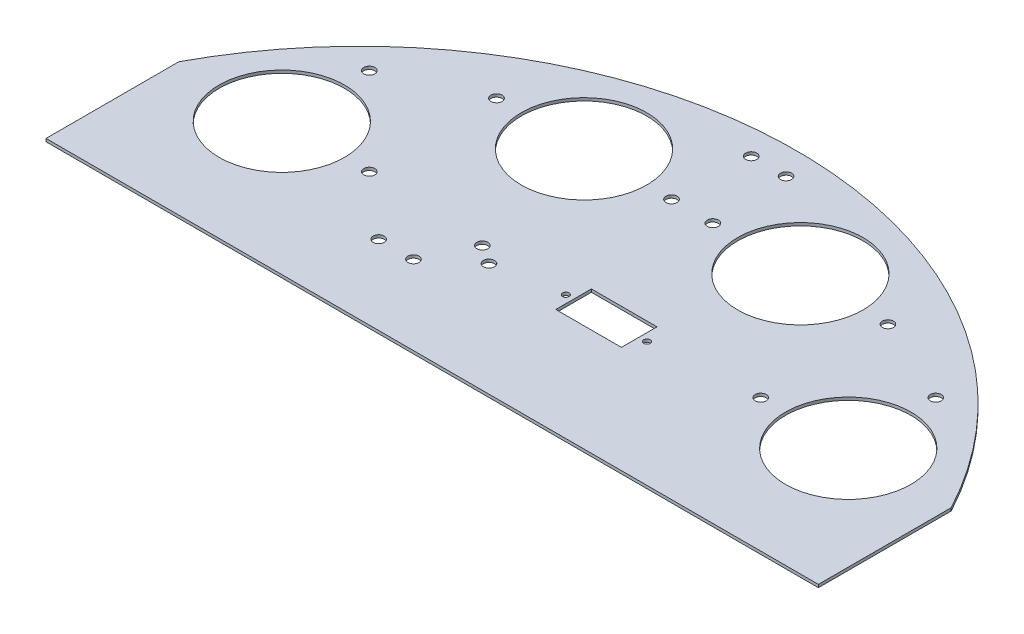
ISO-10303-21;
HEADER;
FILE_DESCRIPTION(('STEP AP214'),'2;1');
FILE_NAME('part.step','',(''),(''),'','','');
FILE_SCHEMA(('AUTOMOTIVE_DESIGN { 1 0 10303 214 1 1 1 1 }'));
ENDSEC;
DATA;
#1=APPLICATION_CONTEXT('core data for automotive mechanical design processes');
#2=APPLICATION_PROTOCOL_DEFINITION('international standard','automotive_design',2000,#1);
#3=PRODUCT_CONTEXT('',#1,'mechanical');
#4=PRODUCT('Part','Part','',(#3));
#5=PRODUCT_RELATED_PRODUCT_CATEGORY('part','',(#4));
#6=PRODUCT_DEFINITION_FORMATION('','',#4);
#7=PRODUCT_DEFINITION_CONTEXT('part definition',#1,'design');
#8=PRODUCT_DEFINITION('design','',#6,#7);
#9=PRODUCT_DEFINITION_SHAPE('','',#8);
#10=(LENGTH_UNIT() NAMED_UNIT(*) SI_UNIT(.MILLI.,.METRE.));
#11=(NAMED_UNIT(*) PLANE_ANGLE_UNIT() SI_UNIT($,.RADIAN.));
#12=(NAMED_UNIT(*) SI_UNIT($,.STERADIAN.) SOLID_ANGLE_UNIT());
#13=UNCERTAINTY_MEASURE_WITH_UNIT(LENGTH_MEASURE(1.E-05),#10,'distance_accuracy_value','');
#14=(GEOMETRIC_REPRESENTATION_CONTEXT(3) GLOBAL_UNCERTAINTY_ASSIGNED_CONTEXT((#13)) GLOBAL_UNIT_ASSIGNED_CONTEXT((#10,
#11,#12)) REPRESENTATION_CONTEXT('',''));
#15=CARTESIAN_POINT('',(0.,0.,0.));
#16=DIRECTION('',(0.,0.,1.));
#17=DIRECTION('',(1.,0.,0.));
#18=AXIS2_PLACEMENT_3D('',#15,#16,#17);
#19=CARTESIAN_POINT('',(0.,0.,0.));
#20=DIRECTION('',(0.,1.,0.));
#21=DIRECTION('',(0.,0.,1.));
#22=AXIS2_PLACEMENT_3D('',#19,#20,#21);
#23=PLANE('',#22);
#24=CARTESIAN_POINT('',(67.237534512333,0.,-26.561617597691));
#25=DIRECTION('',(0.,-1.,0.));
#26=DIRECTION('',(0.,0.,-1.));
#27=AXIS2_PLACEMENT_3D('',#24,#25,#26);
#28=CIRCLE('',#27,1.89865);
#29=CARTESIAN_POINT('',(67.237534512333,0.,-28.460267597691));
#30=VERTEX_POINT('',#29);
#31=EDGE_CURVE('E472',#30,#30,#28,.T.);
#32=ORIENTED_EDGE('',*,*,#31,.F.);
#33=EDGE_LOOP('',(#32));
#34=FACE_BOUND('',#33,.T.);
#35=CARTESIAN_POINT('',(67.2375345123306,0.,-70.1541692780059));
#36=DIRECTION('',(0.,-1.,0.));
#37=DIRECTION('',(0.,0.,-1.));
#38=AXIS2_PLACEMENT_3D('',#35,#36,#37);
#39=CIRCLE('',#38,1.89865);
#40=CARTESIAN_POINT('',(67.2375345123306,0.,-72.0528192780059));
#41=VERTEX_POINT('',#40);
#42=EDGE_CURVE('E480',#41,#41,#39,.T.);
#43=ORIENTED_EDGE('',*,*,#42,.F.);
#44=EDGE_LOOP('',(#43));
#45=FACE_BOUND('',#44,.T.);
#46=CARTESIAN_POINT('',(7.23753451233063,0.,-70.1541692780059));
#47=DIRECTION('',(0.,-1.,0.));
#48=DIRECTION('',(0.,0.,-1.));
#49=AXIS2_PLACEMENT_3D('',#46,#47,#48);
#50=CIRCLE('',#49,1.89865);
#51=CARTESIAN_POINT('',(7.23753451233063,0.,-72.0528192780059));
#52=VERTEX_POINT('',#51);
#53=EDGE_CURVE('E486',#52,#52,#50,.T.);
#54=ORIENTED_EDGE('',*,*,#53,.F.);
#55=EDGE_LOOP('',(#54));
#56=FACE_BOUND('',#55,.T.);
#57=CARTESIAN_POINT('',(-6.92654413765696,0.,-70.1541692780059));
#58=DIRECTION('',(0.,-1.,0.));
#59=DIRECTION('',(0.,0.,-1.));
#60=AXIS2_PLACEMENT_3D('',#57,#58,#59);
#61=CIRCLE('',#60,1.89865);
#62=CARTESIAN_POINT('',(-6.92654413765696,0.,-72.0528192780059));
#63=VERTEX_POINT('',#62);
#64=EDGE_CURVE('E492',#63,#63,#61,.T.);
#65=ORIENTED_EDGE('',*,*,#64,.F.);
#66=EDGE_LOOP('',(#65));
#67=FACE_BOUND('',#66,.T.);
#68=CARTESIAN_POINT('',(-66.926544137657,0.,-70.1541692780059));
#69=DIRECTION('',(0.,-1.,0.));
#70=DIRECTION('',(0.,0.,-1.));
#71=AXIS2_PLACEMENT_3D('',#68,#69,#70);
#72=CIRCLE('',#71,1.89865);
#73=CARTESIAN_POINT('',(-66.926544137657,0.,-72.0528192780059));
#74=VERTEX_POINT('',#73);
#75=EDGE_CURVE('E498',#74,#74,#72,.T.);
#76=ORIENTED_EDGE('',*,*,#75,.F.);
#77=EDGE_LOOP('',(#76));
#78=FACE_BOUND('',#77,.T.);
#79=CARTESIAN_POINT('',(-96.9265441376548,0.,-56.5616175976809));
#80=DIRECTION('',(0.,-1.,0.));
#81=DIRECTION('',(0.,0.,-1.));
#82=AXIS2_PLACEMENT_3D('',#79,#80,#81);
#83=CIRCLE('',#82,1.89865);
#84=CARTESIAN_POINT('',(-96.9265441376548,0.,-58.4602675976809));
#85=VERTEX_POINT('',#84);
#86=EDGE_CURVE('E504',#85,#85,#83,.T.);
#87=ORIENTED_EDGE('',*,*,#86,.F.);
#88=EDGE_LOOP('',(#87));
#89=FACE_BOUND('',#88,.T.);
#90=CARTESIAN_POINT('',(-66.9265441376548,0.,-26.561617597691));
#91=DIRECTION('',(0.,-1.,0.));
#92=DIRECTION('',(0.,0.,-1.));
#93=AXIS2_PLACEMENT_3D('',#90,#91,#92);
#94=CIRCLE('',#93,1.89865);
#95=CARTESIAN_POINT('',(-66.9265441376548,0.,-28.460267597691));
#96=VERTEX_POINT('',#95);
#97=EDGE_CURVE('E510',#96,#96,#94,.T.);
#98=ORIENTED_EDGE('',*,*,#97,.F.);
#99=EDGE_LOOP('',(#98));
#100=FACE_BOUND('',#99,.T.);
#101=CARTESIAN_POINT('',(-19.1543473807719,0.,-19.7948636797243));
#102=DIRECTION('',(0.,-1.,0.));
#103=DIRECTION('',(0.,0.,-1.));
#104=AXIS2_PLACEMENT_3D('',#101,#102,#103);
#105=CIRCLE('',#104,1.89865);
#106=CARTESIAN_POINT('',(-19.1543473807719,0.,-21.6935136797243));
#107=VERTEX_POINT('',#106);
#108=EDGE_CURVE('E516',#107,#107,#105,.T.);
#109=ORIENTED_EDGE('',*,*,#108,.F.);
#110=EDGE_LOOP('',(#109));
#111=FACE_BOUND('',#110,.T.);
#112=CARTESIAN_POINT('',(-45.2913650837094,0.,-8.12316032959307));
#113=DIRECTION('',(0.,-1.,0.));
#114=DIRECTION('',(0.,0.,-1.));
#115=AXIS2_PLACEMENT_3D('',#112,#113,#114);
#116=CIRCLE('',#115,1.89865);
#117=CARTESIAN_POINT('',(-45.2913650837094,0.,-10.0218103295931));
#118=VERTEX_POINT('',#117);
#119=EDGE_CURVE('E522',#118,#118,#116,.T.);
#120=ORIENTED_EDGE('',*,*,#119,.F.);
#121=EDGE_LOOP('',(#120));
#122=FACE_BOUND('',#121,.T.);
#123=CARTESIAN_POINT('',(-33.3613650837094,0.,-8.12316032959307));
#124=DIRECTION('',(0.,-1.,0.));
#125=DIRECTION('',(0.,0.,-1.));
#126=AXIS2_PLACEMENT_3D('',#123,#124,#125);
#127=CIRCLE('',#126,1.89865);
#128=CARTESIAN_POINT('',(-33.3613650837094,0.,-10.0218103295931));
#129=VERTEX_POINT('',#128);
#130=EDGE_CURVE('E528',#129,#129,#127,.T.);
#131=ORIENTED_EDGE('',*,*,#130,.F.);
#132=EDGE_LOOP('',(#131));
#133=FACE_BOUND('',#132,.T.);
#134=CARTESIAN_POINT('',(-6.06113532178358,0.,-96.6113301229937));
#135=DIRECTION('',(0.,-1.,0.));
#136=DIRECTION('',(0.,0.,-1.));
#137=AXIS2_PLACEMENT_3D('',#134,#135,#136);
#138=CIRCLE('',#137,1.89865);
#139=CARTESIAN_POINT('',(-6.06113532178358,0.,-98.5099801229937));
#140=VERTEX_POINT('',#139);
#141=EDGE_CURVE('E534',#140,#140,#138,.T.);
#142=ORIENTED_EDGE('',*,*,#141,.F.);
#143=EDGE_LOOP('',(#142));
#144=FACE_BOUND('',#143,.T.);
#145=CARTESIAN_POINT('',(5.86886720958533,0.,-96.6113301229937));
#146=DIRECTION('',(0.,-1.,0.));
#147=DIRECTION('',(0.,0.,-1.));
#148=AXIS2_PLACEMENT_3D('',#145,#146,#147);
#149=CIRCLE('',#148,1.89865);
#150=CARTESIAN_POINT('',(5.86886720958533,0.,-98.5099801229937));
#151=VERTEX_POINT('',#150);
#152=EDGE_CURVE('E229',#151,#151,#149,.T.);
#153=ORIENTED_EDGE('',*,*,#152,.F.);
#154=EDGE_LOOP('',(#153));
#155=FACE_BOUND('',#154,.T.);
#156=CARTESIAN_POINT('',(3.27642308215973,0.,-23.7231603295504));
#157=DIRECTION('',(0.,-1.,0.));
#158=DIRECTION('',(0.,0.,-1.));
#159=AXIS2_PLACEMENT_3D('',#156,#157,#158);
#160=CIRCLE('',#159,1.10000000000447);
#161=CARTESIAN_POINT('',(3.27642308215973,0.,-24.8231603295549));
#162=VERTEX_POINT('',#161);
#163=EDGE_CURVE('E124',#162,#162,#160,.T.);
#164=ORIENTED_EDGE('',*,*,#163,.F.);
#165=EDGE_LOOP('',(#164));
#166=FACE_BOUND('',#165,.T.);
#167=CARTESIAN_POINT('',(31.0764230821597,0.,-23.7231603295576));
#168=DIRECTION('',(0.,-1.,0.));
#169=DIRECTION('',(0.,0.,-1.));
#170=AXIS2_PLACEMENT_3D('',#167,#168,#169);
#171=CIRCLE('',#170,1.10000000000448);
#172=CARTESIAN_POINT('',(31.0764230821597,0.,-24.823160329562));
#173=VERTEX_POINT('',#172);
#174=EDGE_CURVE('E240',#173,#173,#171,.T.);
#175=ORIENTED_EDGE('',*,*,#174,.F.);
#176=EDGE_LOOP('',(#175));
#177=FACE_BOUND('',#176,.T.);
#178=CARTESIAN_POINT('',(97.237534512333,0.,-26.561617597691));
#179=DIRECTION('',(0.,1.,0.));
#180=DIRECTION('',(0.,0.,1.));
#181=AXIS2_PLACEMENT_3D('',#178,#179,#180);
#182=CIRCLE('',#181,21.5);
#183=CARTESIAN_POINT('',(97.237534512333,0.,-5.06161759769103));
#184=VERTEX_POINT('',#183);
#185=EDGE_CURVE('E144',#184,#184,#182,.T.);
#186=ORIENTED_EDGE('',*,*,#185,.T.);
#187=EDGE_LOOP('',(#186));
#188=FACE_BOUND('',#187,.T.);
#189=CARTESIAN_POINT('',(37.2375345123306,0.,-70.1541692780098));
#190=DIRECTION('',(0.,1.,0.));
#191=DIRECTION('',(0.,0.,1.));
#192=AXIS2_PLACEMENT_3D('',#189,#190,#191);
#193=CIRCLE('',#192,21.5);
#194=CARTESIAN_POINT('',(37.2375345123306,0.,-48.6541692780098));
#195=VERTEX_POINT('',#194);
#196=EDGE_CURVE('E181',#195,#195,#193,.T.);
#197=ORIENTED_EDGE('',*,*,#196,.T.);
#198=EDGE_LOOP('',(#197));
#199=FACE_BOUND('',#198,.T.);
#200=CARTESIAN_POINT('',(-36.926544137657,0.,-70.1541692780059));
#201=DIRECTION('',(0.,1.,0.));
#202=DIRECTION('',(0.,0.,1.));
#203=AXIS2_PLACEMENT_3D('',#200,#201,#202);
#204=CIRCLE('',#203,21.5);
#205=CARTESIAN_POINT('',(-36.926544137657,0.,-48.6541692780059));
#206=VERTEX_POINT('',#205);
#207=EDGE_CURVE('E178',#206,#206,#204,.T.);
#208=ORIENTED_EDGE('',*,*,#207,.T.);
#209=EDGE_LOOP('',(#208));
#210=FACE_BOUND('',#209,.T.);
#211=CARTESIAN_POINT('',(-96.9265441376548,0.,-26.5616175976809));
#212=DIRECTION('',(0.,1.,0.));
#213=DIRECTION('',(0.,0.,1.));
#214=AXIS2_PLACEMENT_3D('',#211,#212,#213);
#215=CIRCLE('',#214,21.5);
#216=CARTESIAN_POINT('',(-96.9265441376548,0.,-5.0616175976809));
#217=VERTEX_POINT('',#216);
#218=EDGE_CURVE('E175',#217,#217,#215,.T.);
#219=ORIENTED_EDGE('',*,*,#218,.T.);
#220=EDGE_LOOP('',(#219));
#221=FACE_BOUND('',#220,.T.);
#222=DIRECTION('',(0.,0.,1.));
#223=VECTOR('',#222,1.);
#224=CARTESIAN_POINT('',(-132.226234516957,0.,0.));
#225=LINE('',#224,#223);
#226=CARTESIAN_POINT('',(-132.226234516957,0.,-26.5616175976809));
#227=VERTEX_POINT('',#226);
#228=CARTESIAN_POINT('',(-132.226234516957,0.,18.9726126774052));
#229=VERTEX_POINT('',#228);
#230=EDGE_CURVE('E137',#227,#229,#225,.T.);
#231=ORIENTED_EDGE('',*,*,#230,.F.);
#232=CARTESIAN_POINT('',(0.155495187338843,0.,43.9726126774052));
#233=DIRECTION('',(0.,1.,0.));
#234=DIRECTION('',(0.,0.,1.));
#235=AXIS2_PLACEMENT_3D('',#232,#233,#234);
#236=CIRCLE('',#235,150.);
#237=CARTESIAN_POINT('',(132.537224891629,0.,-26.561617597691));
#238=VERTEX_POINT('',#237);
#239=EDGE_CURVE('E173',#238,#227,#236,.T.);
#240=ORIENTED_EDGE('',*,*,#239,.F.);
#241=DIRECTION('',(0.,0.,1.));
#242=VECTOR('',#241,1.);
#243=CARTESIAN_POINT('',(132.537224891629,0.,0.));
#244=LINE('',#243,#242);
#245=CARTESIAN_POINT('',(132.537224891629,0.,18.9726126774052));
#246=VERTEX_POINT('',#245);
#247=EDGE_CURVE('E170',#238,#246,#244,.T.);
#248=ORIENTED_EDGE('',*,*,#247,.T.);
#249=DIRECTION('',(-1.,0.,0.));
#250=VECTOR('',#249,1.);
#251=CARTESIAN_POINT('',(0.,0.,18.9726126774052));
#252=LINE('',#251,#250);
#253=EDGE_CURVE('E167',#246,#229,#252,.T.);
#254=ORIENTED_EDGE('',*,*,#253,.T.);
#255=EDGE_LOOP('',(#231,#240,#248,#254));
#256=FACE_BOUND('',#255,.T.);
#257=DIRECTION('',(1.,0.,0.));
#258=VECTOR('',#257,1.);
#259=CARTESIAN_POINT('',(0.,0.,-17.6231603295567));
#260=LINE('',#259,#258);
#261=CARTESIAN_POINT('',(5.92642308216108,0.,-17.6231603295567));
#262=VERTEX_POINT('',#261);
#263=CARTESIAN_POINT('',(28.4264230821584,0.,-17.6231603295567));
#264=VERTEX_POINT('',#263);
#265=EDGE_CURVE('E60',#262,#264,#260,.T.);
#266=ORIENTED_EDGE('',*,*,#265,.T.);
#267=DIRECTION('',(0.,0.,-1.));
#268=VECTOR('',#267,1.);
#269=CARTESIAN_POINT('',(28.4264230821584,0.,0.));
#270=LINE('',#269,#268);
#271=CARTESIAN_POINT('',(28.4264230821584,0.,-29.8231603295513));
#272=VERTEX_POINT('',#271);
#273=EDGE_CURVE('E118',#264,#272,#270,.T.);
#274=ORIENTED_EDGE('',*,*,#273,.T.);
#275=DIRECTION('',(-1.,0.,0.));
#276=VECTOR('',#275,1.);
#277=CARTESIAN_POINT('',(0.,0.,-29.8231603295513));
#278=LINE('',#277,#276);
#279=CARTESIAN_POINT('',(5.92642308216108,0.,-29.8231603295513));
#280=VERTEX_POINT('',#279);
#281=EDGE_CURVE('E121',#272,#280,#278,.T.);
#282=ORIENTED_EDGE('',*,*,#281,.T.);
#283=DIRECTION('',(0.,0.,1.));
#284=VECTOR('',#283,1.);
#285=CARTESIAN_POINT('',(5.92642308216108,0.,0.));
#286=LINE('',#285,#284);
#287=EDGE_CURVE('E130',#280,#262,#286,.T.);
#288=ORIENTED_EDGE('',*,*,#287,.T.);
#289=EDGE_LOOP('',(#266,#274,#282,#288));
#290=FACE_BOUND('',#289,.T.);
#291=CARTESIAN_POINT('',(-25.6482402627617,0.,-24.0247401835058));
#292=DIRECTION('',(0.,-1.,0.));
#293=DIRECTION('',(0.,0.,-1.));
#294=AXIS2_PLACEMENT_3D('',#291,#292,#293);
#295=CIRCLE('',#294,1.89865);
#296=CARTESIAN_POINT('',(-25.6482402627617,0.,-25.9233901835058));
#297=VERTEX_POINT('',#296);
#298=EDGE_CURVE('E228',#297,#297,#295,.T.);
#299=ORIENTED_EDGE('',*,*,#298,.F.);
#300=EDGE_LOOP('',(#299));
#301=FACE_BOUND('',#300,.T.);
#302=CARTESIAN_POINT('',(97.237534512333,0.,-56.561617597691));
#303=DIRECTION('',(0.,-1.,0.));
#304=DIRECTION('',(0.,0.,-1.));
#305=AXIS2_PLACEMENT_3D('',#302,#303,#304);
#306=CIRCLE('',#305,1.89865);
#307=CARTESIAN_POINT('',(97.237534512333,0.,-58.460267597691));
#308=VERTEX_POINT('',#307);
#309=EDGE_CURVE('E469',#308,#308,#306,.T.);
#310=ORIENTED_EDGE('',*,*,#309,.F.);
#311=EDGE_LOOP('',(#310));
#312=FACE_BOUND('',#311,.T.);
#313=ADVANCED_FACE('F37',(#34,#45,#56,#67,#78,#89,#100,#111,#122,#133,#144,#155,#166,#177,#188,
#199,#210,#221,#256,#290,#301,#312),#23,.F.);
#314=CARTESIAN_POINT('',(0.,1.,0.));
#315=DIRECTION('',(0.,1.,0.));
#316=DIRECTION('',(0.,0.,1.));
#317=AXIS2_PLACEMENT_3D('',#314,#315,#316);
#318=PLANE('',#317);
#319=CARTESIAN_POINT('',(97.237534512333,1.,-56.561617597691));
#320=DIRECTION('',(0.,-1.,0.));
#321=DIRECTION('',(0.,0.,-1.));
#322=AXIS2_PLACEMENT_3D('',#319,#320,#321);
#323=CIRCLE('',#322,1.89865);
#324=CARTESIAN_POINT('',(97.237534512333,1.,-58.460267597691));
#325=VERTEX_POINT('',#324);
#326=EDGE_CURVE('E466',#325,#325,#323,.T.);
#327=ORIENTED_EDGE('',*,*,#326,.T.);
#328=EDGE_LOOP('',(#327));
#329=FACE_BOUND('',#328,.T.);
#330=CARTESIAN_POINT('',(67.237534512333,1.,-26.561617597691));
#331=DIRECTION('',(0.,-1.,0.));
#332=DIRECTION('',(0.,0.,-1.));
#333=AXIS2_PLACEMENT_3D('',#330,#331,#332);
#334=CIRCLE('',#333,1.89865);
#335=CARTESIAN_POINT('',(67.237534512333,1.,-28.460267597691));
#336=VERTEX_POINT('',#335);
#337=EDGE_CURVE('E477',#336,#336,#334,.T.);
#338=ORIENTED_EDGE('',*,*,#337,.T.);
#339=EDGE_LOOP('',(#338));
#340=FACE_BOUND('',#339,.T.);
#341=CARTESIAN_POINT('',(67.2375345123306,1.,-70.1541692780059));
#342=DIRECTION('',(0.,-1.,0.));
#343=DIRECTION('',(0.,0.,-1.));
#344=AXIS2_PLACEMENT_3D('',#341,#342,#343);
#345=CIRCLE('',#344,1.89865);
#346=CARTESIAN_POINT('',(67.2375345123306,1.,-72.0528192780059));
#347=VERTEX_POINT('',#346);
#348=EDGE_CURVE('E483',#347,#347,#345,.T.);
#349=ORIENTED_EDGE('',*,*,#348,.T.);
#350=EDGE_LOOP('',(#349));
#351=FACE_BOUND('',#350,.T.);
#352=CARTESIAN_POINT('',(7.23753451233063,1.,-70.1541692780059));
#353=DIRECTION('',(0.,-1.,0.));
#354=DIRECTION('',(0.,0.,-1.));
#355=AXIS2_PLACEMENT_3D('',#352,#353,#354);
#356=CIRCLE('',#355,1.89865);
#357=CARTESIAN_POINT('',(7.23753451233063,1.,-72.0528192780059));
#358=VERTEX_POINT('',#357);
#359=EDGE_CURVE('E489',#358,#358,#356,.T.);
#360=ORIENTED_EDGE('',*,*,#359,.T.);
#361=EDGE_LOOP('',(#360));
#362=FACE_BOUND('',#361,.T.);
#363=CARTESIAN_POINT('',(-6.92654413765696,1.,-70.1541692780059));
#364=DIRECTION('',(0.,-1.,0.));
#365=DIRECTION('',(0.,0.,-1.));
#366=AXIS2_PLACEMENT_3D('',#363,#364,#365);
#367=CIRCLE('',#366,1.89865);
#368=CARTESIAN_POINT('',(-6.92654413765696,1.,-72.0528192780059));
#369=VERTEX_POINT('',#368);
#370=EDGE_CURVE('E495',#369,#369,#367,.T.);
#371=ORIENTED_EDGE('',*,*,#370,.T.);
#372=EDGE_LOOP('',(#371));
#373=FACE_BOUND('',#372,.T.);
#374=CARTESIAN_POINT('',(-66.926544137657,1.,-70.1541692780059));
#375=DIRECTION('',(0.,-1.,0.));
#376=DIRECTION('',(0.,0.,-1.));
#377=AXIS2_PLACEMENT_3D('',#374,#375,#376);
#378=CIRCLE('',#377,1.89865);
#379=CARTESIAN_POINT('',(-66.926544137657,1.,-72.0528192780059));
#380=VERTEX_POINT('',#379);
#381=EDGE_CURVE('E501',#380,#380,#378,.T.);
#382=ORIENTED_EDGE('',*,*,#381,.T.);
#383=EDGE_LOOP('',(#382));
#384=FACE_BOUND('',#383,.T.);
#385=CARTESIAN_POINT('',(-96.9265441376548,1.,-56.5616175976809));
#386=DIRECTION('',(0.,-1.,0.));
#387=DIRECTION('',(0.,0.,-1.));
#388=AXIS2_PLACEMENT_3D('',#385,#386,#387);
#389=CIRCLE('',#388,1.89865);
#390=CARTESIAN_POINT('',(-96.9265441376548,1.,-58.4602675976809));
#391=VERTEX_POINT('',#390);
#392=EDGE_CURVE('E507',#391,#391,#389,.T.);
#393=ORIENTED_EDGE('',*,*,#392,.T.);
#394=EDGE_LOOP('',(#393));
#395=FACE_BOUND('',#394,.T.);
#396=CARTESIAN_POINT('',(-66.9265441376548,1.,-26.561617597691));
#397=DIRECTION('',(0.,-1.,0.));
#398=DIRECTION('',(0.,0.,-1.));
#399=AXIS2_PLACEMENT_3D('',#396,#397,#398);
#400=CIRCLE('',#399,1.89865);
#401=CARTESIAN_POINT('',(-66.9265441376548,1.,-28.460267597691));
#402=VERTEX_POINT('',#401);
#403=EDGE_CURVE('E513',#402,#402,#400,.T.);
#404=ORIENTED_EDGE('',*,*,#403,.T.);
#405=EDGE_LOOP('',(#404));
#406=FACE_BOUND('',#405,.T.);
#407=CARTESIAN_POINT('',(-19.1543473807719,1.,-19.7948636797243));
#408=DIRECTION('',(0.,-1.,0.));
#409=DIRECTION('',(0.,0.,-1.));
#410=AXIS2_PLACEMENT_3D('',#407,#408,#409);
#411=CIRCLE('',#410,1.89865);
#412=CARTESIAN_POINT('',(-19.1543473807719,1.,-21.6935136797243));
#413=VERTEX_POINT('',#412);
#414=EDGE_CURVE('E519',#413,#413,#411,.T.);
#415=ORIENTED_EDGE('',*,*,#414,.T.);
#416=EDGE_LOOP('',(#415));
#417=FACE_BOUND('',#416,.T.);
#418=CARTESIAN_POINT('',(-45.2913650837094,1.,-8.12316032959307));
#419=DIRECTION('',(0.,-1.,0.));
#420=DIRECTION('',(0.,0.,-1.));
#421=AXIS2_PLACEMENT_3D('',#418,#419,#420);
#422=CIRCLE('',#421,1.89865);
#423=CARTESIAN_POINT('',(-45.2913650837094,1.,-10.0218103295931));
#424=VERTEX_POINT('',#423);
#425=EDGE_CURVE('E525',#424,#424,#422,.T.);
#426=ORIENTED_EDGE('',*,*,#425,.T.);
#427=EDGE_LOOP('',(#426));
#428=FACE_BOUND('',#427,.T.);
#429=CARTESIAN_POINT('',(-33.3613650837094,1.,-8.12316032959307));
#430=DIRECTION('',(0.,-1.,0.));
#431=DIRECTION('',(0.,0.,-1.));
#432=AXIS2_PLACEMENT_3D('',#429,#430,#431);
#433=CIRCLE('',#432,1.89865);
#434=CARTESIAN_POINT('',(-33.3613650837094,1.,-10.0218103295931));
#435=VERTEX_POINT('',#434);
#436=EDGE_CURVE('E531',#435,#435,#433,.T.);
#437=ORIENTED_EDGE('',*,*,#436,.T.);
#438=EDGE_LOOP('',(#437));
#439=FACE_BOUND('',#438,.T.);
#440=CARTESIAN_POINT('',(-6.06113532178358,1.,-96.6113301229937));
#441=DIRECTION('',(0.,-1.,0.));
#442=DIRECTION('',(0.,0.,-1.));
#443=AXIS2_PLACEMENT_3D('',#440,#441,#442);
#444=CIRCLE('',#443,1.89865);
#445=CARTESIAN_POINT('',(-6.06113532178358,1.,-98.5099801229937));
#446=VERTEX_POINT('',#445);
#447=EDGE_CURVE('E234',#446,#446,#444,.T.);
#448=ORIENTED_EDGE('',*,*,#447,.T.);
#449=EDGE_LOOP('',(#448));
#450=FACE_BOUND('',#449,.T.);
#451=DIRECTION('',(0.,0.,-1.));
#452=VECTOR('',#451,1.);
#453=CARTESIAN_POINT('',(28.4264230821584,1.,0.));
#454=LINE('',#453,#452);
#455=CARTESIAN_POINT('',(28.4264230821584,1.,-17.6231603295567));
#456=VERTEX_POINT('',#455);
#457=CARTESIAN_POINT('',(28.4264230821584,1.,-29.8231603295513));
#458=VERTEX_POINT('',#457);
#459=EDGE_CURVE('E113',#456,#458,#454,.T.);
#460=ORIENTED_EDGE('',*,*,#459,.F.);
#461=DIRECTION('',(1.,0.,0.));
#462=VECTOR('',#461,1.);
#463=CARTESIAN_POINT('',(0.,1.,-17.6231603295567));
#464=LINE('',#463,#462);
#465=CARTESIAN_POINT('',(5.92642308216108,1.,-17.6231603295567));
#466=VERTEX_POINT('',#465);
#467=EDGE_CURVE('E109',#466,#456,#464,.T.);
#468=ORIENTED_EDGE('',*,*,#467,.F.);
#469=DIRECTION('',(0.,0.,1.));
#470=VECTOR('',#469,1.);
#471=CARTESIAN_POINT('',(5.92642308216108,1.,0.));
#472=LINE('',#471,#470);
#473=CARTESIAN_POINT('',(5.92642308216108,1.,-29.8231603295513));
#474=VERTEX_POINT('',#473);
#475=EDGE_CURVE('E101',#474,#466,#472,.T.);
#476=ORIENTED_EDGE('',*,*,#475,.F.);
#477=DIRECTION('',(-1.,0.,0.));
#478=VECTOR('',#477,1.);
#479=CARTESIAN_POINT('',(0.,1.,-29.8231603295513));
#480=LINE('',#479,#478);
#481=EDGE_CURVE('E108',#458,#474,#480,.T.);
#482=ORIENTED_EDGE('',*,*,#481,.F.);
#483=EDGE_LOOP('',(#460,#468,#476,#482));
#484=FACE_BOUND('',#483,.T.);
#485=CARTESIAN_POINT('',(97.237534512333,1.,-26.561617597691));
#486=DIRECTION('',(0.,1.,0.));
#487=DIRECTION('',(0.,0.,1.));
#488=AXIS2_PLACEMENT_3D('',#485,#486,#487);
#489=CIRCLE('',#488,21.5);
#490=CARTESIAN_POINT('',(97.237534512333,1.,-5.06161759769103));
#491=VERTEX_POINT('',#490);
#492=EDGE_CURVE('E161',#491,#491,#489,.T.);
#493=ORIENTED_EDGE('',*,*,#492,.F.);
#494=EDGE_LOOP('',(#493));
#495=FACE_BOUND('',#494,.T.);
#496=CARTESIAN_POINT('',(37.2375345123306,1.,-70.1541692780098));
#497=DIRECTION('',(0.,1.,0.));
#498=DIRECTION('',(0.,0.,1.));
#499=AXIS2_PLACEMENT_3D('',#496,#497,#498);
#500=CIRCLE('',#499,21.5);
#501=CARTESIAN_POINT('',(37.2375345123306,1.,-48.6541692780098));
#502=VERTEX_POINT('',#501);
#503=EDGE_CURVE('E158',#502,#502,#500,.T.);
#504=ORIENTED_EDGE('',*,*,#503,.F.);
#505=EDGE_LOOP('',(#504));
#506=FACE_BOUND('',#505,.T.);
#507=CARTESIAN_POINT('',(-36.926544137657,1.,-70.1541692780059));
#508=DIRECTION('',(0.,1.,0.));
#509=DIRECTION('',(0.,0.,1.));
#510=AXIS2_PLACEMENT_3D('',#507,#508,#509);
#511=CIRCLE('',#510,21.5);
#512=CARTESIAN_POINT('',(-36.926544137657,1.,-48.6541692780059));
#513=VERTEX_POINT('',#512);
#514=EDGE_CURVE('E155',#513,#513,#511,.T.);
#515=ORIENTED_EDGE('',*,*,#514,.F.);
#516=EDGE_LOOP('',(#515));
#517=FACE_BOUND('',#516,.T.);
#518=CARTESIAN_POINT('',(-96.9265441376548,1.,-26.5616175976809));
#519=DIRECTION('',(0.,1.,0.));
#520=DIRECTION('',(0.,0.,1.));
#521=AXIS2_PLACEMENT_3D('',#518,#519,#520);
#522=CIRCLE('',#521,21.5);
#523=CARTESIAN_POINT('',(-96.9265441376548,1.,-5.0616175976809));
#524=VERTEX_POINT('',#523);
#525=EDGE_CURVE('E152',#524,#524,#522,.T.);
#526=ORIENTED_EDGE('',*,*,#525,.F.);
#527=EDGE_LOOP('',(#526));
#528=FACE_BOUND('',#527,.T.);
#529=DIRECTION('',(0.,0.,1.));
#530=VECTOR('',#529,1.);
#531=CARTESIAN_POINT('',(-132.226234516957,1.,0.));
#532=LINE('',#531,#530);
#533=CARTESIAN_POINT('',(-132.226234516957,1.,-26.5616175976809));
#534=VERTEX_POINT('',#533);
#535=CARTESIAN_POINT('',(-132.226234516957,1.,18.9726126774052));
#536=VERTEX_POINT('',#535);
#537=EDGE_CURVE('E141',#534,#536,#532,.T.);
#538=ORIENTED_EDGE('',*,*,#537,.T.);
#539=DIRECTION('',(-1.,0.,0.));
#540=VECTOR('',#539,1.);
#541=CARTESIAN_POINT('',(0.,1.,18.9726126774052));
#542=LINE('',#541,#540);
#543=CARTESIAN_POINT('',(132.537224891629,1.,18.9726126774052));
#544=VERTEX_POINT('',#543);
#545=EDGE_CURVE('E143',#544,#536,#542,.T.);
#546=ORIENTED_EDGE('',*,*,#545,.F.);
#547=DIRECTION('',(0.,0.,1.));
#548=VECTOR('',#547,1.);
#549=CARTESIAN_POINT('',(132.537224891629,1.,0.));
#550=LINE('',#549,#548);
#551=CARTESIAN_POINT('',(132.537224891629,1.,-26.561617597691));
#552=VERTEX_POINT('',#551);
#553=EDGE_CURVE('E147',#552,#544,#550,.T.);
#554=ORIENTED_EDGE('',*,*,#553,.F.);
#555=CARTESIAN_POINT('',(0.155495187338843,1.,43.9726126774052));
#556=DIRECTION('',(0.,1.,0.));
#557=DIRECTION('',(0.,0.,1.));
#558=AXIS2_PLACEMENT_3D('',#555,#556,#557);
#559=CIRCLE('',#558,150.);
#560=EDGE_CURVE('E150',#552,#534,#559,.T.);
#561=ORIENTED_EDGE('',*,*,#560,.T.);
#562=EDGE_LOOP('',(#538,#546,#554,#561));
#563=FACE_BOUND('',#562,.T.);
#564=CARTESIAN_POINT('',(31.0764230821597,1.,-23.7231603295576));
#565=DIRECTION('',(0.,-1.,0.));
#566=DIRECTION('',(0.,0.,-1.));
#567=AXIS2_PLACEMENT_3D('',#564,#565,#566);
#568=CIRCLE('',#567,1.10000000000448);
#569=CARTESIAN_POINT('',(31.0764230821597,1.,-24.823160329562));
#570=VERTEX_POINT('',#569);
#571=EDGE_CURVE('E131',#570,#570,#568,.T.);
#572=ORIENTED_EDGE('',*,*,#571,.T.);
#573=EDGE_LOOP('',(#572));
#574=FACE_BOUND('',#573,.T.);
#575=CARTESIAN_POINT('',(3.27642308215973,1.,-23.7231603295504));
#576=DIRECTION('',(0.,-1.,0.));
#577=DIRECTION('',(0.,0.,-1.));
#578=AXIS2_PLACEMENT_3D('',#575,#576,#577);
#579=CIRCLE('',#578,1.10000000000447);
#580=CARTESIAN_POINT('',(3.27642308215973,1.,-24.8231603295549));
#581=VERTEX_POINT('',#580);
#582=EDGE_CURVE('E219',#581,#581,#579,.T.);
#583=ORIENTED_EDGE('',*,*,#582,.T.);
#584=EDGE_LOOP('',(#583));
#585=FACE_BOUND('',#584,.T.);
#586=CARTESIAN_POINT('',(-25.6482402627617,1.,-24.0247401835058));
#587=DIRECTION('',(0.,-1.,0.));
#588=DIRECTION('',(0.,0.,-1.));
#589=AXIS2_PLACEMENT_3D('',#586,#587,#588);
#590=CIRCLE('',#589,1.89865);
#591=CARTESIAN_POINT('',(-25.6482402627617,1.,-25.9233901835058));
#592=VERTEX_POINT('',#591);
#593=EDGE_CURVE('E223',#592,#592,#590,.T.);
#594=ORIENTED_EDGE('',*,*,#593,.T.);
#595=EDGE_LOOP('',(#594));
#596=FACE_BOUND('',#595,.T.);
#597=CARTESIAN_POINT('',(5.86886720958533,1.,-96.6113301229937));
#598=DIRECTION('',(0.,-1.,0.));
#599=DIRECTION('',(0.,0.,-1.));
#600=AXIS2_PLACEMENT_3D('',#597,#598,#599);
#601=CIRCLE('',#600,1.89865);
#602=CARTESIAN_POINT('',(5.86886720958533,1.,-98.5099801229937));
#603=VERTEX_POINT('',#602);
#604=EDGE_CURVE('E226',#603,#603,#601,.T.);
#605=ORIENTED_EDGE('',*,*,#604,.T.);
#606=EDGE_LOOP('',(#605));
#607=FACE_BOUND('',#606,.T.);
#608=ADVANCED_FACE('F116',(#329,#340,#351,#362,#373,#384,#395,#406,#417,#428,#439,#450,#484,
#495,#506,#517,#528,#563,#574,#585,#596,#607),#318,.T.);
#609=CARTESIAN_POINT('',(-132.226234516957,1.,0.));
#610=DIRECTION('',(1.,0.,0.));
#611=DIRECTION('',(0.,0.,-1.));
#612=AXIS2_PLACEMENT_3D('',#609,#610,#611);
#613=PLANE('',#612);
#614=ORIENTED_EDGE('',*,*,#230,.T.);
#615=DIRECTION('',(0.,-1.,0.));
#616=VECTOR('',#615,1.);
#617=CARTESIAN_POINT('',(-132.226234516957,1.,18.9726126774052));
#618=LINE('',#617,#616);
#619=EDGE_CURVE('E11',#536,#229,#618,.T.);
#620=ORIENTED_EDGE('',*,*,#619,.F.);
#621=ORIENTED_EDGE('',*,*,#537,.F.);
#622=DIRECTION('',(0.,-1.,0.));
#623=VECTOR('',#622,1.);
#624=CARTESIAN_POINT('',(-132.226234516957,1.,-26.5616175976809));
#625=LINE('',#624,#623);
#626=EDGE_CURVE('E164',#534,#227,#625,.T.);
#627=ORIENTED_EDGE('',*,*,#626,.T.);
#628=EDGE_LOOP('',(#614,#620,#621,#627));
#629=FACE_BOUND('',#628,.T.);
#630=ADVANCED_FACE('F39',(#629),#613,.F.);
#631=CARTESIAN_POINT('',(0.,1.,18.9726126774052));
#632=DIRECTION('',(0.,0.,1.));
#633=DIRECTION('',(1.,0.,0.));
#634=AXIS2_PLACEMENT_3D('',#631,#632,#633);
#635=PLANE('',#634);
#636=ORIENTED_EDGE('',*,*,#253,.F.);
#637=DIRECTION('',(0.,-1.,0.));
#638=VECTOR('',#637,1.);
#639=CARTESIAN_POINT('',(132.537224891629,1.,18.9726126774052));
#640=LINE('',#639,#638);
#641=EDGE_CURVE('E45',#544,#246,#640,.T.);
#642=ORIENTED_EDGE('',*,*,#641,.F.);
#643=ORIENTED_EDGE('',*,*,#545,.T.);
#644=ORIENTED_EDGE('',*,*,#619,.T.);
#645=EDGE_LOOP('',(#636,#642,#643,#644));
#646=FACE_BOUND('',#645,.T.);
#647=ADVANCED_FACE('F196',(#646),#635,.T.);
#648=CARTESIAN_POINT('',(132.537224891629,1.,0.));
#649=DIRECTION('',(1.,0.,0.));
#650=DIRECTION('',(0.,0.,-1.));
#651=AXIS2_PLACEMENT_3D('',#648,#649,#650);
#652=PLANE('',#651);
#653=ORIENTED_EDGE('',*,*,#247,.F.);
#654=DIRECTION('',(0.,-1.,0.));
#655=VECTOR('',#654,1.);
#656=CARTESIAN_POINT('',(132.537224891629,1.,-26.561617597691));
#657=LINE('',#656,#655);
#658=EDGE_CURVE('E188',#552,#238,#657,.T.);
#659=ORIENTED_EDGE('',*,*,#658,.F.);
#660=ORIENTED_EDGE('',*,*,#553,.T.);
#661=ORIENTED_EDGE('',*,*,#641,.T.);
#662=EDGE_LOOP('',(#653,#659,#660,#661));
#663=FACE_BOUND('',#662,.T.);
#664=ADVANCED_FACE('F192',(#663),#652,.T.);
#665=CARTESIAN_POINT('',(37.2375345123306,1.,-70.1541692780098));
#666=DIRECTION('',(0.,-1.,0.));
#667=DIRECTION('',(0.,0.,-1.));
#668=AXIS2_PLACEMENT_3D('',#665,#666,#667);
#669=CYLINDRICAL_SURFACE('',#668,21.5);
#670=ORIENTED_EDGE('',*,*,#503,.T.);
#671=EDGE_LOOP('',(#670));
#672=FACE_BOUND('',#671,.T.);
#673=ORIENTED_EDGE('',*,*,#196,.F.);
#674=EDGE_LOOP('',(#673));
#675=FACE_BOUND('',#674,.T.);
#676=ADVANCED_FACE('F272',(#672,#675),#669,.F.);
#677=CARTESIAN_POINT('',(-36.926544137657,1.,-70.1541692780059));
#678=DIRECTION('',(0.,-1.,0.));
#679=DIRECTION('',(0.,0.,-1.));
#680=AXIS2_PLACEMENT_3D('',#677,#678,#679);
#681=CYLINDRICAL_SURFACE('',#680,21.5);
#682=ORIENTED_EDGE('',*,*,#514,.T.);
#683=EDGE_LOOP('',(#682));
#684=FACE_BOUND('',#683,.T.);
#685=ORIENTED_EDGE('',*,*,#207,.F.);
#686=EDGE_LOOP('',(#685));
#687=FACE_BOUND('',#686,.T.);
#688=ADVANCED_FACE('F263',(#684,#687),#681,.F.);
#689=CARTESIAN_POINT('',(-96.9265441376548,1.,-26.5616175976809));
#690=DIRECTION('',(0.,-1.,0.));
#691=DIRECTION('',(0.,0.,-1.));
#692=AXIS2_PLACEMENT_3D('',#689,#690,#691);
#693=CYLINDRICAL_SURFACE('',#692,21.5);
#694=ORIENTED_EDGE('',*,*,#525,.T.);
#695=EDGE_LOOP('',(#694));
#696=FACE_BOUND('',#695,.T.);
#697=ORIENTED_EDGE('',*,*,#218,.F.);
#698=EDGE_LOOP('',(#697));
#699=FACE_BOUND('',#698,.T.);
#700=ADVANCED_FACE('F261',(#696,#699),#693,.F.);
#701=CARTESIAN_POINT('',(0.155495187338843,1.,43.9726126774052));
#702=DIRECTION('',(0.,-1.,0.));
#703=DIRECTION('',(0.,0.,-1.));
#704=AXIS2_PLACEMENT_3D('',#701,#702,#703);
#705=CYLINDRICAL_SURFACE('',#704,150.);
#706=ORIENTED_EDGE('',*,*,#239,.T.);
#707=ORIENTED_EDGE('',*,*,#626,.F.);
#708=ORIENTED_EDGE('',*,*,#560,.F.);
#709=ORIENTED_EDGE('',*,*,#658,.T.);
#710=EDGE_LOOP('',(#706,#707,#708,#709));
#711=FACE_BOUND('',#710,.T.);
#712=ADVANCED_FACE('F204',(#711),#705,.T.);
#713=CARTESIAN_POINT('',(97.237534512333,1.,-26.561617597691));
#714=DIRECTION('',(0.,-1.,0.));
#715=DIRECTION('',(0.,0.,-1.));
#716=AXIS2_PLACEMENT_3D('',#713,#714,#715);
#717=CYLINDRICAL_SURFACE('',#716,21.5);
#718=ORIENTED_EDGE('',*,*,#492,.T.);
#719=EDGE_LOOP('',(#718));
#720=FACE_BOUND('',#719,.T.);
#721=ORIENTED_EDGE('',*,*,#185,.F.);
#722=EDGE_LOOP('',(#721));
#723=FACE_BOUND('',#722,.T.);
#724=ADVANCED_FACE('F270',(#720,#723),#717,.F.);
#725=CARTESIAN_POINT('',(0.,1.,-17.6231603295567));
#726=DIRECTION('',(0.,0.,-1.));
#727=DIRECTION('',(-1.,0.,0.));
#728=AXIS2_PLACEMENT_3D('',#725,#726,#727);
#729=PLANE('',#728);
#730=ORIENTED_EDGE('',*,*,#265,.F.);
#731=DIRECTION('',(0.,-1.,0.));
#732=VECTOR('',#731,1.);
#733=CARTESIAN_POINT('',(5.92642308216108,1.,-17.6231603295567));
#734=LINE('',#733,#732);
#735=EDGE_CURVE('E103',#466,#262,#734,.T.);
#736=ORIENTED_EDGE('',*,*,#735,.F.);
#737=ORIENTED_EDGE('',*,*,#467,.T.);
#738=DIRECTION('',(0.,-1.,0.));
#739=VECTOR('',#738,1.);
#740=CARTESIAN_POINT('',(28.4264230821584,1.,-17.6231603295567));
#741=LINE('',#740,#739);
#742=EDGE_CURVE('E135',#456,#264,#741,.T.);
#743=ORIENTED_EDGE('',*,*,#742,.T.);
#744=EDGE_LOOP('',(#730,#736,#737,#743));
#745=FACE_BOUND('',#744,.T.);
#746=ADVANCED_FACE('F111',(#745),#729,.T.);
#747=CARTESIAN_POINT('',(28.4264230821584,1.,0.));
#748=DIRECTION('',(-1.,0.,0.));
#749=DIRECTION('',(0.,0.,1.));
#750=AXIS2_PLACEMENT_3D('',#747,#748,#749);
#751=PLANE('',#750);
#752=ORIENTED_EDGE('',*,*,#273,.F.);
#753=ORIENTED_EDGE('',*,*,#742,.F.);
#754=ORIENTED_EDGE('',*,*,#459,.T.);
#755=DIRECTION('',(0.,-1.,0.));
#756=VECTOR('',#755,1.);
#757=CARTESIAN_POINT('',(28.4264230821584,1.,-29.8231603295513));
#758=LINE('',#757,#756);
#759=EDGE_CURVE('E138',#458,#272,#758,.T.);
#760=ORIENTED_EDGE('',*,*,#759,.T.);
#761=EDGE_LOOP('',(#752,#753,#754,#760));
#762=FACE_BOUND('',#761,.T.);
#763=ADVANCED_FACE('F333',(#762),#751,.T.);
#764=CARTESIAN_POINT('',(0.,1.,-29.8231603295513));
#765=DIRECTION('',(0.,0.,1.));
#766=DIRECTION('',(1.,0.,0.));
#767=AXIS2_PLACEMENT_3D('',#764,#765,#766);
#768=PLANE('',#767);
#769=ORIENTED_EDGE('',*,*,#281,.F.);
#770=ORIENTED_EDGE('',*,*,#759,.F.);
#771=ORIENTED_EDGE('',*,*,#481,.T.);
#772=DIRECTION('',(0.,-1.,0.));
#773=VECTOR('',#772,1.);
#774=CARTESIAN_POINT('',(5.92642308216108,1.,-29.8231603295513));
#775=LINE('',#774,#773);
#776=EDGE_CURVE('E52',#474,#280,#775,.T.);
#777=ORIENTED_EDGE('',*,*,#776,.T.);
#778=EDGE_LOOP('',(#769,#770,#771,#777));
#779=FACE_BOUND('',#778,.T.);
#780=ADVANCED_FACE('F324',(#779),#768,.T.);
#781=CARTESIAN_POINT('',(5.92642308216108,1.,0.));
#782=DIRECTION('',(1.,0.,0.));
#783=DIRECTION('',(0.,0.,-1.));
#784=AXIS2_PLACEMENT_3D('',#781,#782,#783);
#785=PLANE('',#784);
#786=ORIENTED_EDGE('',*,*,#287,.F.);
#787=ORIENTED_EDGE('',*,*,#776,.F.);
#788=ORIENTED_EDGE('',*,*,#475,.T.);
#789=ORIENTED_EDGE('',*,*,#735,.T.);
#790=EDGE_LOOP('',(#786,#787,#788,#789));
#791=FACE_BOUND('',#790,.T.);
#792=ADVANCED_FACE('F102',(#791),#785,.T.);
#793=CARTESIAN_POINT('',(31.0764230821597,1.,-23.7231603295576));
#794=DIRECTION('',(0.,-1.,0.));
#795=DIRECTION('',(0.,0.,-1.));
#796=AXIS2_PLACEMENT_3D('',#793,#794,#795);
#797=CYLINDRICAL_SURFACE('',#796,1.10000000000448);
#798=ORIENTED_EDGE('',*,*,#571,.F.);
#799=EDGE_LOOP('',(#798));
#800=FACE_BOUND('',#799,.T.);
#801=ORIENTED_EDGE('',*,*,#174,.T.);
#802=EDGE_LOOP('',(#801));
#803=FACE_BOUND('',#802,.T.);
#804=ADVANCED_FACE('F304',(#800,#803),#797,.F.);
#805=CARTESIAN_POINT('',(3.27642308215973,1.,-23.7231603295504));
#806=DIRECTION('',(0.,-1.,0.));
#807=DIRECTION('',(0.,0.,-1.));
#808=AXIS2_PLACEMENT_3D('',#805,#806,#807);
#809=CYLINDRICAL_SURFACE('',#808,1.10000000000447);
#810=ORIENTED_EDGE('',*,*,#582,.F.);
#811=EDGE_LOOP('',(#810));
#812=FACE_BOUND('',#811,.T.);
#813=ORIENTED_EDGE('',*,*,#163,.T.);
#814=EDGE_LOOP('',(#813));
#815=FACE_BOUND('',#814,.T.);
#816=ADVANCED_FACE('F245',(#812,#815),#809,.F.);
#817=CARTESIAN_POINT('',(-25.6482402627617,0.,-24.0247401835058));
#818=DIRECTION('',(0.,-1.,0.));
#819=DIRECTION('',(0.,0.,-1.));
#820=AXIS2_PLACEMENT_3D('',#817,#818,#819);
#821=CYLINDRICAL_SURFACE('',#820,1.89865);
#822=ORIENTED_EDGE('',*,*,#593,.F.);
#823=EDGE_LOOP('',(#822));
#824=FACE_BOUND('',#823,.T.);
#825=ORIENTED_EDGE('',*,*,#298,.T.);
#826=EDGE_LOOP('',(#825));
#827=FACE_BOUND('',#826,.T.);
#828=ADVANCED_FACE('F303',(#824,#827),#821,.F.);
#829=CARTESIAN_POINT('',(5.86886720958533,0.,-96.6113301229937));
#830=DIRECTION('',(0.,-1.,0.));
#831=DIRECTION('',(0.,0.,-1.));
#832=AXIS2_PLACEMENT_3D('',#829,#830,#831);
#833=CYLINDRICAL_SURFACE('',#832,1.89865);
#834=ORIENTED_EDGE('',*,*,#604,.F.);
#835=EDGE_LOOP('',(#834));
#836=FACE_BOUND('',#835,.T.);
#837=ORIENTED_EDGE('',*,*,#152,.T.);
#838=EDGE_LOOP('',(#837));
#839=FACE_BOUND('',#838,.T.);
#840=ADVANCED_FACE('F410',(#836,#839),#833,.F.);
#841=CARTESIAN_POINT('',(-6.06113532178358,0.,-96.6113301229937));
#842=DIRECTION('',(0.,-1.,0.));
#843=DIRECTION('',(0.,0.,-1.));
#844=AXIS2_PLACEMENT_3D('',#841,#842,#843);
#845=CYLINDRICAL_SURFACE('',#844,1.89865);
#846=ORIENTED_EDGE('',*,*,#447,.F.);
#847=EDGE_LOOP('',(#846));
#848=FACE_BOUND('',#847,.T.);
#849=ORIENTED_EDGE('',*,*,#141,.T.);
#850=EDGE_LOOP('',(#849));
#851=FACE_BOUND('',#850,.T.);
#852=ADVANCED_FACE('F414',(#848,#851),#845,.F.);
#853=CARTESIAN_POINT('',(-33.3613650837094,0.,-8.12316032959307));
#854=DIRECTION('',(0.,-1.,0.));
#855=DIRECTION('',(0.,0.,-1.));
#856=AXIS2_PLACEMENT_3D('',#853,#854,#855);
#857=CYLINDRICAL_SURFACE('',#856,1.89865);
#858=ORIENTED_EDGE('',*,*,#436,.F.);
#859=EDGE_LOOP('',(#858));
#860=FACE_BOUND('',#859,.T.);
#861=ORIENTED_EDGE('',*,*,#130,.T.);
#862=EDGE_LOOP('',(#861));
#863=FACE_BOUND('',#862,.T.);
#864=ADVANCED_FACE('F417',(#860,#863),#857,.F.);
#865=CARTESIAN_POINT('',(-45.2913650837094,0.,-8.12316032959307));
#866=DIRECTION('',(0.,-1.,0.));
#867=DIRECTION('',(0.,0.,-1.));
#868=AXIS2_PLACEMENT_3D('',#865,#866,#867);
#869=CYLINDRICAL_SURFACE('',#868,1.89865);
#870=ORIENTED_EDGE('',*,*,#425,.F.);
#871=EDGE_LOOP('',(#870));
#872=FACE_BOUND('',#871,.T.);
#873=ORIENTED_EDGE('',*,*,#119,.T.);
#874=EDGE_LOOP('',(#873));
#875=FACE_BOUND('',#874,.T.);
#876=ADVANCED_FACE('F421',(#872,#875),#869,.F.);
#877=CARTESIAN_POINT('',(-19.1543473807719,0.,-19.7948636797243));
#878=DIRECTION('',(0.,-1.,0.));
#879=DIRECTION('',(0.,0.,-1.));
#880=AXIS2_PLACEMENT_3D('',#877,#878,#879);
#881=CYLINDRICAL_SURFACE('',#880,1.89865);
#882=ORIENTED_EDGE('',*,*,#414,.F.);
#883=EDGE_LOOP('',(#882));
#884=FACE_BOUND('',#883,.T.);
#885=ORIENTED_EDGE('',*,*,#108,.T.);
#886=EDGE_LOOP('',(#885));
#887=FACE_BOUND('',#886,.T.);
#888=ADVANCED_FACE('F425',(#884,#887),#881,.F.);
#889=CARTESIAN_POINT('',(-66.9265441376548,0.,-26.561617597691));
#890=DIRECTION('',(0.,-1.,0.));
#891=DIRECTION('',(0.,0.,-1.));
#892=AXIS2_PLACEMENT_3D('',#889,#890,#891);
#893=CYLINDRICAL_SURFACE('',#892,1.89865);
#894=ORIENTED_EDGE('',*,*,#403,.F.);
#895=EDGE_LOOP('',(#894));
#896=FACE_BOUND('',#895,.T.);
#897=ORIENTED_EDGE('',*,*,#97,.T.);
#898=EDGE_LOOP('',(#897));
#899=FACE_BOUND('',#898,.T.);
#900=ADVANCED_FACE('F429',(#896,#899),#893,.F.);
#901=CARTESIAN_POINT('',(-96.9265441376548,0.,-56.5616175976809));
#902=DIRECTION('',(0.,-1.,0.));
#903=DIRECTION('',(0.,0.,-1.));
#904=AXIS2_PLACEMENT_3D('',#901,#902,#903);
#905=CYLINDRICAL_SURFACE('',#904,1.89865);
#906=ORIENTED_EDGE('',*,*,#392,.F.);
#907=EDGE_LOOP('',(#906));
#908=FACE_BOUND('',#907,.T.);
#909=ORIENTED_EDGE('',*,*,#86,.T.);
#910=EDGE_LOOP('',(#909));
#911=FACE_BOUND('',#910,.T.);
#912=ADVANCED_FACE('F433',(#908,#911),#905,.F.);
#913=CARTESIAN_POINT('',(-66.926544137657,0.,-70.1541692780059));
#914=DIRECTION('',(0.,-1.,0.));
#915=DIRECTION('',(0.,0.,-1.));
#916=AXIS2_PLACEMENT_3D('',#913,#914,#915);
#917=CYLINDRICAL_SURFACE('',#916,1.89865);
#918=ORIENTED_EDGE('',*,*,#381,.F.);
#919=EDGE_LOOP('',(#918));
#920=FACE_BOUND('',#919,.T.);
#921=ORIENTED_EDGE('',*,*,#75,.T.);
#922=EDGE_LOOP('',(#921));
#923=FACE_BOUND('',#922,.T.);
#924=ADVANCED_FACE('F437',(#920,#923),#917,.F.);
#925=CARTESIAN_POINT('',(-6.92654413765696,0.,-70.1541692780059));
#926=DIRECTION('',(0.,-1.,0.));
#927=DIRECTION('',(0.,0.,-1.));
#928=AXIS2_PLACEMENT_3D('',#925,#926,#927);
#929=CYLINDRICAL_SURFACE('',#928,1.89865);
#930=ORIENTED_EDGE('',*,*,#370,.F.);
#931=EDGE_LOOP('',(#930));
#932=FACE_BOUND('',#931,.T.);
#933=ORIENTED_EDGE('',*,*,#64,.T.);
#934=EDGE_LOOP('',(#933));
#935=FACE_BOUND('',#934,.T.);
#936=ADVANCED_FACE('F441',(#932,#935),#929,.F.);
#937=CARTESIAN_POINT('',(7.23753451233063,0.,-70.1541692780059));
#938=DIRECTION('',(0.,-1.,0.));
#939=DIRECTION('',(0.,0.,-1.));
#940=AXIS2_PLACEMENT_3D('',#937,#938,#939);
#941=CYLINDRICAL_SURFACE('',#940,1.89865);
#942=ORIENTED_EDGE('',*,*,#359,.F.);
#943=EDGE_LOOP('',(#942));
#944=FACE_BOUND('',#943,.T.);
#945=ORIENTED_EDGE('',*,*,#53,.T.);
#946=EDGE_LOOP('',(#945));
#947=FACE_BOUND('',#946,.T.);
#948=ADVANCED_FACE('F445',(#944,#947),#941,.F.);
#949=CARTESIAN_POINT('',(67.2375345123306,0.,-70.1541692780059));
#950=DIRECTION('',(0.,-1.,0.));
#951=DIRECTION('',(0.,0.,-1.));
#952=AXIS2_PLACEMENT_3D('',#949,#950,#951);
#953=CYLINDRICAL_SURFACE('',#952,1.89865);
#954=ORIENTED_EDGE('',*,*,#348,.F.);
#955=EDGE_LOOP('',(#954));
#956=FACE_BOUND('',#955,.T.);
#957=ORIENTED_EDGE('',*,*,#42,.T.);
#958=EDGE_LOOP('',(#957));
#959=FACE_BOUND('',#958,.T.);
#960=ADVANCED_FACE('F449',(#956,#959),#953,.F.);
#961=CARTESIAN_POINT('',(67.237534512333,0.,-26.561617597691));
#962=DIRECTION('',(0.,-1.,0.));
#963=DIRECTION('',(0.,0.,-1.));
#964=AXIS2_PLACEMENT_3D('',#961,#962,#963);
#965=CYLINDRICAL_SURFACE('',#964,1.89865);
#966=ORIENTED_EDGE('',*,*,#337,.F.);
#967=EDGE_LOOP('',(#966));
#968=FACE_BOUND('',#967,.T.);
#969=ORIENTED_EDGE('',*,*,#31,.T.);
#970=EDGE_LOOP('',(#969));
#971=FACE_BOUND('',#970,.T.);
#972=ADVANCED_FACE('F453',(#968,#971),#965,.F.);
#973=CARTESIAN_POINT('',(97.237534512333,0.,-56.561617597691));
#974=DIRECTION('',(0.,-1.,0.));
#975=DIRECTION('',(0.,0.,-1.));
#976=AXIS2_PLACEMENT_3D('',#973,#974,#975);
#977=CYLINDRICAL_SURFACE('',#976,1.89865);
#978=ORIENTED_EDGE('',*,*,#326,.F.);
#979=EDGE_LOOP('',(#978));
#980=FACE_BOUND('',#979,.T.);
#981=ORIENTED_EDGE('',*,*,#309,.T.);
#982=EDGE_LOOP('',(#981));
#983=FACE_BOUND('',#982,.T.);
#984=ADVANCED_FACE('F457',(#980,#983),#977,.F.);
#985=CLOSED_SHELL('',(#313,#608,#630,#647,#664,#676,#688,#700,#712,#724,#746,#763,#780,#792,
#804,#816,#828,#840,#852,#864,#876,#888,#900,#912,#924,#936,#948,#960,#972,#984));
#986=MANIFOLD_SOLID_BREP('B2',#985);
#987=ADVANCED_BREP_SHAPE_REPRESENTATION('',(#18,#986),#14);
#988=SHAPE_DEFINITION_REPRESENTATION(#9,#987);
ENDSEC;
END-ISO-10303-21;
